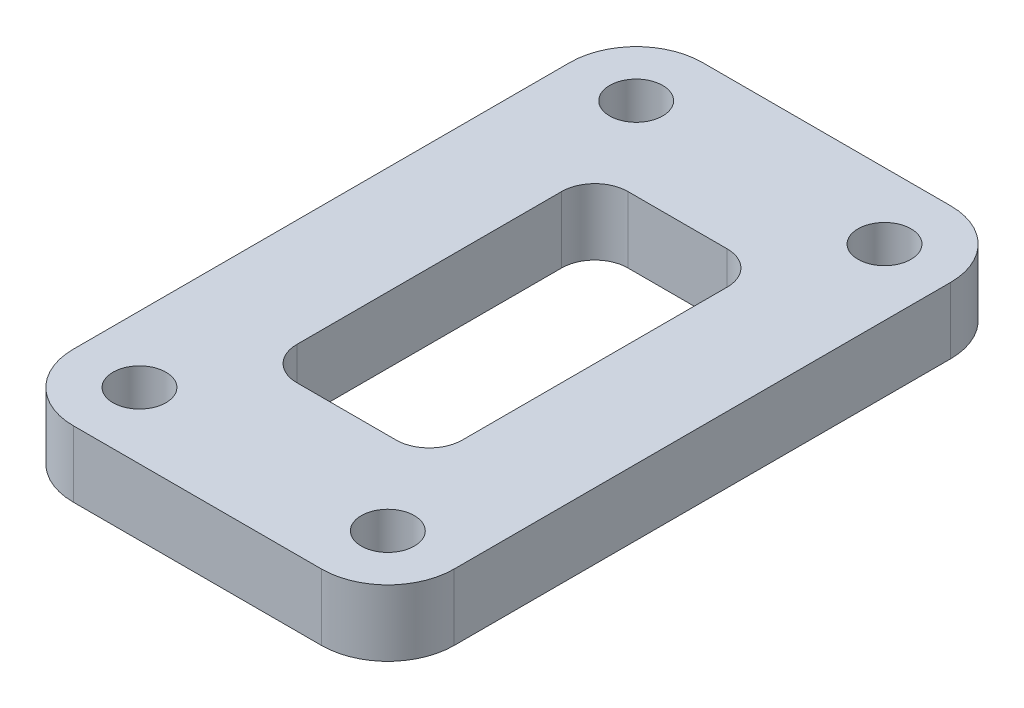
ISO-10303-21;
HEADER;
FILE_DESCRIPTION(('STEP AP214'),'2;1');
FILE_NAME('part.step','',(''),(''),'','','');
FILE_SCHEMA(('AUTOMOTIVE_DESIGN { 1 0 10303 214 1 1 1 1 }'));
ENDSEC;
DATA;
#1=APPLICATION_CONTEXT('core data for automotive mechanical design processes');
#2=APPLICATION_PROTOCOL_DEFINITION('international standard','automotive_design',2000,#1);
#3=PRODUCT_CONTEXT('',#1,'mechanical');
#4=PRODUCT('Part','Part','',(#3));
#5=PRODUCT_RELATED_PRODUCT_CATEGORY('part','',(#4));
#6=PRODUCT_DEFINITION_FORMATION('','',#4);
#7=PRODUCT_DEFINITION_CONTEXT('part definition',#1,'design');
#8=PRODUCT_DEFINITION('design','',#6,#7);
#9=PRODUCT_DEFINITION_SHAPE('','',#8);
#10=(LENGTH_UNIT() NAMED_UNIT(*) SI_UNIT(.MILLI.,.METRE.));
#11=(NAMED_UNIT(*) PLANE_ANGLE_UNIT() SI_UNIT($,.RADIAN.));
#12=(NAMED_UNIT(*) SI_UNIT($,.STERADIAN.) SOLID_ANGLE_UNIT());
#13=UNCERTAINTY_MEASURE_WITH_UNIT(LENGTH_MEASURE(1.E-05),#10,'distance_accuracy_value','');
#14=(GEOMETRIC_REPRESENTATION_CONTEXT(3) GLOBAL_UNCERTAINTY_ASSIGNED_CONTEXT((#13)) GLOBAL_UNIT_ASSIGNED_CONTEXT((#10,
#11,#12)) REPRESENTATION_CONTEXT('',''));
#15=CARTESIAN_POINT('',(0.,0.,0.));
#16=DIRECTION('',(0.,0.,1.));
#17=DIRECTION('',(1.,0.,0.));
#18=AXIS2_PLACEMENT_3D('',#15,#16,#17);
#19=CARTESIAN_POINT('',(-7.5,4.,15.));
#20=DIRECTION('',(0.,1.,0.));
#21=DIRECTION('',(0.,0.,1.));
#22=AXIS2_PLACEMENT_3D('',#19,#20,#21);
#23=PLANE('',#22);
#24=CARTESIAN_POINT('',(3.,4.,8.));
#25=DIRECTION('',(0.,1.,0.));
#26=DIRECTION('',(0.,0.,1.));
#27=AXIS2_PLACEMENT_3D('',#24,#25,#26);
#28=CIRCLE('',#27,2.);
#29=CARTESIAN_POINT('',(2.99999999999999,4.,10.));
#30=VERTEX_POINT('',#29);
#31=CARTESIAN_POINT('',(5.,4.,7.99999999999999));
#32=VERTEX_POINT('',#31);
#33=EDGE_CURVE('E61',#30,#32,#28,.T.);
#34=ORIENTED_EDGE('',*,*,#33,.F.);
#35=DIRECTION('',(1.,0.,0.));
#36=VECTOR('',#35,1.);
#37=CARTESIAN_POINT('',(-2.99999999999998,4.,10.));
#38=LINE('',#37,#36);
#39=CARTESIAN_POINT('',(-2.99999999999998,4.,10.));
#40=VERTEX_POINT('',#39);
#41=EDGE_CURVE('E181',#40,#30,#38,.T.);
#42=ORIENTED_EDGE('',*,*,#41,.F.);
#43=CARTESIAN_POINT('',(-3.,4.,8.));
#44=DIRECTION('',(0.,1.,0.));
#45=DIRECTION('',(0.,0.,1.));
#46=AXIS2_PLACEMENT_3D('',#43,#44,#45);
#47=CIRCLE('',#46,2.);
#48=CARTESIAN_POINT('',(-5.,4.,7.99999999999999));
#49=VERTEX_POINT('',#48);
#50=EDGE_CURVE('E185',#49,#40,#47,.T.);
#51=ORIENTED_EDGE('',*,*,#50,.F.);
#52=DIRECTION('',(0.,0.,1.));
#53=VECTOR('',#52,1.);
#54=CARTESIAN_POINT('',(-5.,4.,-7.99999999999999));
#55=LINE('',#54,#53);
#56=CARTESIAN_POINT('',(-5.,4.,-7.99999999999999));
#57=VERTEX_POINT('',#56);
#58=EDGE_CURVE('E224',#57,#49,#55,.T.);
#59=ORIENTED_EDGE('',*,*,#58,.F.);
#60=CARTESIAN_POINT('',(-3.,4.,-8.));
#61=DIRECTION('',(0.,1.,0.));
#62=DIRECTION('',(0.,0.,1.));
#63=AXIS2_PLACEMENT_3D('',#60,#61,#62);
#64=CIRCLE('',#63,2.);
#65=CARTESIAN_POINT('',(-2.99999999999999,4.,-10.));
#66=VERTEX_POINT('',#65);
#67=EDGE_CURVE('E220',#66,#57,#64,.T.);
#68=ORIENTED_EDGE('',*,*,#67,.F.);
#69=DIRECTION('',(-1.,0.,0.));
#70=VECTOR('',#69,1.);
#71=CARTESIAN_POINT('',(-2.99999999999999,4.,-10.));
#72=LINE('',#71,#70);
#73=CARTESIAN_POINT('',(2.99999999999999,4.,-10.));
#74=VERTEX_POINT('',#73);
#75=EDGE_CURVE('E216',#74,#66,#72,.T.);
#76=ORIENTED_EDGE('',*,*,#75,.F.);
#77=CARTESIAN_POINT('',(3.,4.,-8.));
#78=DIRECTION('',(0.,1.,0.));
#79=DIRECTION('',(0.,0.,-1.));
#80=AXIS2_PLACEMENT_3D('',#77,#78,#79);
#81=CIRCLE('',#80,2.);
#82=CARTESIAN_POINT('',(5.,4.,-7.99999999999999));
#83=VERTEX_POINT('',#82);
#84=EDGE_CURVE('E212',#83,#74,#81,.T.);
#85=ORIENTED_EDGE('',*,*,#84,.F.);
#86=DIRECTION('',(0.,0.,-1.));
#87=VECTOR('',#86,1.);
#88=CARTESIAN_POINT('',(5.,4.,-7.99999999999999));
#89=LINE('',#88,#87);
#90=EDGE_CURVE('E209',#32,#83,#89,.T.);
#91=ORIENTED_EDGE('',*,*,#90,.F.);
#92=EDGE_LOOP('',(#34,#42,#51,#59,#68,#76,#85,#91));
#93=FACE_BOUND('',#92,.T.);
#94=CARTESIAN_POINT('',(-7.5,4.,15.));
#95=DIRECTION('',(0.,1.,0.));
#96=DIRECTION('',(0.,0.,1.));
#97=AXIS2_PLACEMENT_3D('',#94,#95,#96);
#98=CIRCLE('',#97,1.6);
#99=CARTESIAN_POINT('',(-7.5,4.,16.6));
#100=VERTEX_POINT('',#99);
#101=EDGE_CURVE('E260',#100,#100,#98,.T.);
#102=ORIENTED_EDGE('',*,*,#101,.F.);
#103=EDGE_LOOP('',(#102));
#104=FACE_BOUND('',#103,.T.);
#105=CARTESIAN_POINT('',(-7.5,4.,-15.));
#106=DIRECTION('',(0.,1.,0.));
#107=DIRECTION('',(0.,0.,1.));
#108=AXIS2_PLACEMENT_3D('',#105,#106,#107);
#109=CIRCLE('',#108,1.6);
#110=CARTESIAN_POINT('',(-7.5,4.,-13.4));
#111=VERTEX_POINT('',#110);
#112=EDGE_CURVE('E276',#111,#111,#109,.T.);
#113=ORIENTED_EDGE('',*,*,#112,.F.);
#114=EDGE_LOOP('',(#113));
#115=FACE_BOUND('',#114,.T.);
#116=CARTESIAN_POINT('',(-7.5,4.,15.));
#117=DIRECTION('',(0.,1.,0.));
#118=DIRECTION('',(0.,0.,1.));
#119=AXIS2_PLACEMENT_3D('',#116,#117,#118);
#120=CIRCLE('',#119,4.);
#121=CARTESIAN_POINT('',(-11.5,4.,15.));
#122=VERTEX_POINT('',#121);
#123=CARTESIAN_POINT('',(-7.49999999999997,4.,19.));
#124=VERTEX_POINT('',#123);
#125=EDGE_CURVE('E284',#122,#124,#120,.T.);
#126=ORIENTED_EDGE('',*,*,#125,.T.);
#127=DIRECTION('',(1.,0.,0.));
#128=VECTOR('',#127,1.);
#129=CARTESIAN_POINT('',(-7.49999999999997,4.,19.));
#130=LINE('',#129,#128);
#131=CARTESIAN_POINT('',(7.49999999999997,4.,19.));
#132=VERTEX_POINT('',#131);
#133=EDGE_CURVE('E288',#124,#132,#130,.T.);
#134=ORIENTED_EDGE('',*,*,#133,.T.);
#135=CARTESIAN_POINT('',(7.5,4.,15.));
#136=DIRECTION('',(0.,1.,0.));
#137=DIRECTION('',(0.,0.,1.));
#138=AXIS2_PLACEMENT_3D('',#135,#136,#137);
#139=CIRCLE('',#138,4.);
#140=CARTESIAN_POINT('',(11.5,4.,15.));
#141=VERTEX_POINT('',#140);
#142=EDGE_CURVE('E292',#132,#141,#139,.T.);
#143=ORIENTED_EDGE('',*,*,#142,.T.);
#144=DIRECTION('',(0.,0.,-1.));
#145=VECTOR('',#144,1.);
#146=CARTESIAN_POINT('',(11.5,4.,-15.));
#147=LINE('',#146,#145);
#148=CARTESIAN_POINT('',(11.5,4.,-15.));
#149=VERTEX_POINT('',#148);
#150=EDGE_CURVE('E295',#141,#149,#147,.T.);
#151=ORIENTED_EDGE('',*,*,#150,.T.);
#152=CARTESIAN_POINT('',(7.5,4.,-15.));
#153=DIRECTION('',(0.,1.,0.));
#154=DIRECTION('',(0.,0.,1.));
#155=AXIS2_PLACEMENT_3D('',#152,#153,#154);
#156=CIRCLE('',#155,4.);
#157=CARTESIAN_POINT('',(7.49999999999997,4.,-19.));
#158=VERTEX_POINT('',#157);
#159=EDGE_CURVE('E298',#149,#158,#156,.T.);
#160=ORIENTED_EDGE('',*,*,#159,.T.);
#161=DIRECTION('',(-1.,0.,0.));
#162=VECTOR('',#161,1.);
#163=CARTESIAN_POINT('',(-7.49999999999997,4.,-19.));
#164=LINE('',#163,#162);
#165=CARTESIAN_POINT('',(-7.5,4.,-19.));
#166=VERTEX_POINT('',#165);
#167=EDGE_CURVE('E301',#158,#166,#164,.T.);
#168=ORIENTED_EDGE('',*,*,#167,.T.);
#169=CARTESIAN_POINT('',(-7.5,4.,-15.));
#170=DIRECTION('',(0.,1.,0.));
#171=DIRECTION('',(0.,0.,-1.));
#172=AXIS2_PLACEMENT_3D('',#169,#170,#171);
#173=CIRCLE('',#172,4.);
#174=CARTESIAN_POINT('',(-11.5,4.,-15.));
#175=VERTEX_POINT('',#174);
#176=EDGE_CURVE('E304',#166,#175,#173,.T.);
#177=ORIENTED_EDGE('',*,*,#176,.T.);
#178=DIRECTION('',(0.,0.,1.));
#179=VECTOR('',#178,1.);
#180=CARTESIAN_POINT('',(-11.5,4.,-15.));
#181=LINE('',#180,#179);
#182=EDGE_CURVE('E307',#175,#122,#181,.T.);
#183=ORIENTED_EDGE('',*,*,#182,.T.);
#184=EDGE_LOOP('',(#126,#134,#143,#151,#160,#168,#177,#183));
#185=FACE_BOUND('',#184,.T.);
#186=CARTESIAN_POINT('',(7.5,4.,-15.));
#187=DIRECTION('',(0.,1.,0.));
#188=DIRECTION('',(0.,0.,1.));
#189=AXIS2_PLACEMENT_3D('',#186,#187,#188);
#190=CIRCLE('',#189,1.6);
#191=CARTESIAN_POINT('',(7.5,4.,-13.4));
#192=VERTEX_POINT('',#191);
#193=EDGE_CURVE('E268',#192,#192,#190,.T.);
#194=ORIENTED_EDGE('',*,*,#193,.F.);
#195=EDGE_LOOP('',(#194));
#196=FACE_BOUND('',#195,.T.);
#197=CARTESIAN_POINT('',(7.5,4.,15.));
#198=DIRECTION('',(0.,1.,0.));
#199=DIRECTION('',(0.,0.,1.));
#200=AXIS2_PLACEMENT_3D('',#197,#198,#199);
#201=CIRCLE('',#200,1.6);
#202=CARTESIAN_POINT('',(7.5,4.,16.6));
#203=VERTEX_POINT('',#202);
#204=EDGE_CURVE('E252',#203,#203,#201,.T.);
#205=ORIENTED_EDGE('',*,*,#204,.F.);
#206=EDGE_LOOP('',(#205));
#207=FACE_BOUND('',#206,.T.);
#208=ADVANCED_FACE('F45',(#93,#104,#115,#185,#196,#207),#23,.T.);
#209=CARTESIAN_POINT('',(-7.5,0.,15.));
#210=DIRECTION('',(0.,1.,0.));
#211=DIRECTION('',(0.,0.,1.));
#212=AXIS2_PLACEMENT_3D('',#209,#210,#211);
#213=PLANE('',#212);
#214=DIRECTION('',(1.,0.,0.));
#215=VECTOR('',#214,1.);
#216=CARTESIAN_POINT('',(-2.99999999999998,0.,10.));
#217=LINE('',#216,#215);
#218=CARTESIAN_POINT('',(-2.99999999999998,0.,10.));
#219=VERTEX_POINT('',#218);
#220=CARTESIAN_POINT('',(2.99999999999999,0.,10.));
#221=VERTEX_POINT('',#220);
#222=EDGE_CURVE('E168',#219,#221,#217,.T.);
#223=ORIENTED_EDGE('',*,*,#222,.T.);
#224=CARTESIAN_POINT('',(3.,0.,8.));
#225=DIRECTION('',(0.,1.,0.));
#226=DIRECTION('',(0.,0.,1.));
#227=AXIS2_PLACEMENT_3D('',#224,#225,#226);
#228=CIRCLE('',#227,2.);
#229=CARTESIAN_POINT('',(5.,0.,7.99999999999999));
#230=VERTEX_POINT('',#229);
#231=EDGE_CURVE('E161',#221,#230,#228,.T.);
#232=ORIENTED_EDGE('',*,*,#231,.T.);
#233=DIRECTION('',(0.,0.,-1.));
#234=VECTOR('',#233,1.);
#235=CARTESIAN_POINT('',(5.,0.,-7.99999999999999));
#236=LINE('',#235,#234);
#237=CARTESIAN_POINT('',(5.,0.,-7.99999999999999));
#238=VERTEX_POINT('',#237);
#239=EDGE_CURVE('E171',#230,#238,#236,.T.);
#240=ORIENTED_EDGE('',*,*,#239,.T.);
#241=CARTESIAN_POINT('',(3.,0.,-8.));
#242=DIRECTION('',(0.,1.,0.));
#243=DIRECTION('',(0.,0.,-1.));
#244=AXIS2_PLACEMENT_3D('',#241,#242,#243);
#245=CIRCLE('',#244,2.);
#246=CARTESIAN_POINT('',(2.99999999999999,0.,-10.));
#247=VERTEX_POINT('',#246);
#248=EDGE_CURVE('E69',#238,#247,#245,.T.);
#249=ORIENTED_EDGE('',*,*,#248,.T.);
#250=DIRECTION('',(-1.,0.,0.));
#251=VECTOR('',#250,1.);
#252=CARTESIAN_POINT('',(-2.99999999999999,0.,-10.));
#253=LINE('',#252,#251);
#254=CARTESIAN_POINT('',(-2.99999999999999,0.,-10.));
#255=VERTEX_POINT('',#254);
#256=EDGE_CURVE('E190',#247,#255,#253,.T.);
#257=ORIENTED_EDGE('',*,*,#256,.T.);
#258=CARTESIAN_POINT('',(-3.,0.,-8.));
#259=DIRECTION('',(0.,1.,0.));
#260=DIRECTION('',(0.,0.,1.));
#261=AXIS2_PLACEMENT_3D('',#258,#259,#260);
#262=CIRCLE('',#261,2.);
#263=CARTESIAN_POINT('',(-5.,0.,-7.99999999999999));
#264=VERTEX_POINT('',#263);
#265=EDGE_CURVE('E194',#255,#264,#262,.T.);
#266=ORIENTED_EDGE('',*,*,#265,.T.);
#267=DIRECTION('',(0.,0.,1.));
#268=VECTOR('',#267,1.);
#269=CARTESIAN_POINT('',(-5.,0.,-7.99999999999999));
#270=LINE('',#269,#268);
#271=CARTESIAN_POINT('',(-5.,0.,7.99999999999999));
#272=VERTEX_POINT('',#271);
#273=EDGE_CURVE('E198',#264,#272,#270,.T.);
#274=ORIENTED_EDGE('',*,*,#273,.T.);
#275=CARTESIAN_POINT('',(-3.,0.,8.));
#276=DIRECTION('',(0.,1.,0.));
#277=DIRECTION('',(0.,0.,1.));
#278=AXIS2_PLACEMENT_3D('',#275,#276,#277);
#279=CIRCLE('',#278,2.);
#280=EDGE_CURVE('E202',#272,#219,#279,.T.);
#281=ORIENTED_EDGE('',*,*,#280,.T.);
#282=EDGE_LOOP('',(#223,#232,#240,#249,#257,#266,#274,#281));
#283=FACE_BOUND('',#282,.T.);
#284=CARTESIAN_POINT('',(-7.5,0.,15.));
#285=DIRECTION('',(0.,1.,0.));
#286=DIRECTION('',(0.,0.,1.));
#287=AXIS2_PLACEMENT_3D('',#284,#285,#286);
#288=CIRCLE('',#287,4.);
#289=CARTESIAN_POINT('',(-11.5,0.,15.));
#290=VERTEX_POINT('',#289);
#291=CARTESIAN_POINT('',(-7.49999999999997,0.,19.));
#292=VERTEX_POINT('',#291);
#293=EDGE_CURVE('E280',#290,#292,#288,.T.);
#294=ORIENTED_EDGE('',*,*,#293,.F.);
#295=DIRECTION('',(0.,0.,1.));
#296=VECTOR('',#295,1.);
#297=CARTESIAN_POINT('',(-11.5,0.,-15.));
#298=LINE('',#297,#296);
#299=CARTESIAN_POINT('',(-11.5,0.,-15.));
#300=VERTEX_POINT('',#299);
#301=EDGE_CURVE('E289',#300,#290,#298,.T.);
#302=ORIENTED_EDGE('',*,*,#301,.F.);
#303=CARTESIAN_POINT('',(-7.5,0.,-15.));
#304=DIRECTION('',(0.,1.,0.));
#305=DIRECTION('',(0.,0.,-1.));
#306=AXIS2_PLACEMENT_3D('',#303,#304,#305);
#307=CIRCLE('',#306,4.);
#308=CARTESIAN_POINT('',(-7.5,0.,-19.));
#309=VERTEX_POINT('',#308);
#310=EDGE_CURVE('E329',#309,#300,#307,.T.);
#311=ORIENTED_EDGE('',*,*,#310,.F.);
#312=DIRECTION('',(-1.,0.,0.));
#313=VECTOR('',#312,1.);
#314=CARTESIAN_POINT('',(-7.49999999999997,0.,-19.));
#315=LINE('',#314,#313);
#316=CARTESIAN_POINT('',(7.49999999999997,0.,-19.));
#317=VERTEX_POINT('',#316);
#318=EDGE_CURVE('E326',#317,#309,#315,.T.);
#319=ORIENTED_EDGE('',*,*,#318,.F.);
#320=CARTESIAN_POINT('',(7.5,0.,-15.));
#321=DIRECTION('',(0.,1.,0.));
#322=DIRECTION('',(0.,0.,1.));
#323=AXIS2_PLACEMENT_3D('',#320,#321,#322);
#324=CIRCLE('',#323,4.);
#325=CARTESIAN_POINT('',(11.5,0.,-15.));
#326=VERTEX_POINT('',#325);
#327=EDGE_CURVE('E323',#326,#317,#324,.T.);
#328=ORIENTED_EDGE('',*,*,#327,.F.);
#329=DIRECTION('',(0.,0.,-1.));
#330=VECTOR('',#329,1.);
#331=CARTESIAN_POINT('',(11.5,0.,-15.));
#332=LINE('',#331,#330);
#333=CARTESIAN_POINT('',(11.5,0.,15.));
#334=VERTEX_POINT('',#333);
#335=EDGE_CURVE('E320',#334,#326,#332,.T.);
#336=ORIENTED_EDGE('',*,*,#335,.F.);
#337=CARTESIAN_POINT('',(7.5,0.,15.));
#338=DIRECTION('',(0.,1.,0.));
#339=DIRECTION('',(0.,0.,1.));
#340=AXIS2_PLACEMENT_3D('',#337,#338,#339);
#341=CIRCLE('',#340,4.);
#342=CARTESIAN_POINT('',(7.49999999999997,0.,19.));
#343=VERTEX_POINT('',#342);
#344=EDGE_CURVE('E317',#343,#334,#341,.T.);
#345=ORIENTED_EDGE('',*,*,#344,.F.);
#346=DIRECTION('',(1.,0.,0.));
#347=VECTOR('',#346,1.);
#348=CARTESIAN_POINT('',(-7.49999999999997,0.,19.));
#349=LINE('',#348,#347);
#350=EDGE_CURVE('E314',#292,#343,#349,.T.);
#351=ORIENTED_EDGE('',*,*,#350,.F.);
#352=EDGE_LOOP('',(#294,#302,#311,#319,#328,#336,#345,#351));
#353=FACE_BOUND('',#352,.T.);
#354=CARTESIAN_POINT('',(-7.5,0.,-15.));
#355=DIRECTION('',(0.,1.,0.));
#356=DIRECTION('',(0.,0.,1.));
#357=AXIS2_PLACEMENT_3D('',#354,#355,#356);
#358=CIRCLE('',#357,1.6);
#359=CARTESIAN_POINT('',(-7.5,0.,-13.4));
#360=VERTEX_POINT('',#359);
#361=EDGE_CURVE('E272',#360,#360,#358,.T.);
#362=ORIENTED_EDGE('',*,*,#361,.T.);
#363=EDGE_LOOP('',(#362));
#364=FACE_BOUND('',#363,.T.);
#365=CARTESIAN_POINT('',(7.5,0.,-15.));
#366=DIRECTION('',(0.,1.,0.));
#367=DIRECTION('',(0.,0.,1.));
#368=AXIS2_PLACEMENT_3D('',#365,#366,#367);
#369=CIRCLE('',#368,1.6);
#370=CARTESIAN_POINT('',(7.5,0.,-13.4));
#371=VERTEX_POINT('',#370);
#372=EDGE_CURVE('E264',#371,#371,#369,.T.);
#373=ORIENTED_EDGE('',*,*,#372,.T.);
#374=EDGE_LOOP('',(#373));
#375=FACE_BOUND('',#374,.T.);
#376=CARTESIAN_POINT('',(-7.5,0.,15.));
#377=DIRECTION('',(0.,1.,0.));
#378=DIRECTION('',(0.,0.,1.));
#379=AXIS2_PLACEMENT_3D('',#376,#377,#378);
#380=CIRCLE('',#379,1.6);
#381=CARTESIAN_POINT('',(-7.5,0.,16.6));
#382=VERTEX_POINT('',#381);
#383=EDGE_CURVE('E256',#382,#382,#380,.T.);
#384=ORIENTED_EDGE('',*,*,#383,.T.);
#385=EDGE_LOOP('',(#384));
#386=FACE_BOUND('',#385,.T.);
#387=CARTESIAN_POINT('',(7.5,0.,15.));
#388=DIRECTION('',(0.,1.,0.));
#389=DIRECTION('',(0.,0.,1.));
#390=AXIS2_PLACEMENT_3D('',#387,#388,#389);
#391=CIRCLE('',#390,1.6);
#392=CARTESIAN_POINT('',(7.5,0.,16.6));
#393=VERTEX_POINT('',#392);
#394=EDGE_CURVE('E234',#393,#393,#391,.T.);
#395=ORIENTED_EDGE('',*,*,#394,.T.);
#396=EDGE_LOOP('',(#395));
#397=FACE_BOUND('',#396,.T.);
#398=ADVANCED_FACE('F176',(#283,#353,#364,#375,#386,#397),#213,.F.);
#399=CARTESIAN_POINT('',(-7.5,4.,15.));
#400=DIRECTION('',(0.,-1.,0.));
#401=DIRECTION('',(0.,0.,-1.));
#402=AXIS2_PLACEMENT_3D('',#399,#400,#401);
#403=CYLINDRICAL_SURFACE('',#402,4.);
#404=ORIENTED_EDGE('',*,*,#293,.T.);
#405=DIRECTION('',(0.,-1.,0.));
#406=VECTOR('',#405,1.);
#407=CARTESIAN_POINT('',(-7.49999999999997,4.,19.));
#408=LINE('',#407,#406);
#409=EDGE_CURVE('E11',#124,#292,#408,.T.);
#410=ORIENTED_EDGE('',*,*,#409,.F.);
#411=ORIENTED_EDGE('',*,*,#125,.F.);
#412=DIRECTION('',(0.,-1.,0.));
#413=VECTOR('',#412,1.);
#414=CARTESIAN_POINT('',(-11.5,4.,15.));
#415=LINE('',#414,#413);
#416=EDGE_CURVE('E310',#122,#290,#415,.T.);
#417=ORIENTED_EDGE('',*,*,#416,.T.);
#418=EDGE_LOOP('',(#404,#410,#411,#417));
#419=FACE_BOUND('',#418,.T.);
#420=ADVANCED_FACE('F47',(#419),#403,.T.);
#421=CARTESIAN_POINT('',(-7.49999999999997,4.,19.));
#422=DIRECTION('',(0.,0.,-1.));
#423=DIRECTION('',(-1.,0.,0.));
#424=AXIS2_PLACEMENT_3D('',#421,#422,#423);
#425=PLANE('',#424);
#426=ORIENTED_EDGE('',*,*,#350,.T.);
#427=DIRECTION('',(0.,-1.,0.));
#428=VECTOR('',#427,1.);
#429=CARTESIAN_POINT('',(7.49999999999997,4.,19.));
#430=LINE('',#429,#428);
#431=EDGE_CURVE('E54',#132,#343,#430,.T.);
#432=ORIENTED_EDGE('',*,*,#431,.F.);
#433=ORIENTED_EDGE('',*,*,#133,.F.);
#434=ORIENTED_EDGE('',*,*,#409,.T.);
#435=EDGE_LOOP('',(#426,#432,#433,#434));
#436=FACE_BOUND('',#435,.T.);
#437=ADVANCED_FACE('F384',(#436),#425,.F.);
#438=CARTESIAN_POINT('',(7.5,4.,15.));
#439=DIRECTION('',(0.,-1.,0.));
#440=DIRECTION('',(0.,0.,-1.));
#441=AXIS2_PLACEMENT_3D('',#438,#439,#440);
#442=CYLINDRICAL_SURFACE('',#441,4.);
#443=ORIENTED_EDGE('',*,*,#344,.T.);
#444=DIRECTION('',(0.,-1.,0.));
#445=VECTOR('',#444,1.);
#446=CARTESIAN_POINT('',(11.5,4.,15.));
#447=LINE('',#446,#445);
#448=EDGE_CURVE('E353',#141,#334,#447,.T.);
#449=ORIENTED_EDGE('',*,*,#448,.F.);
#450=ORIENTED_EDGE('',*,*,#142,.F.);
#451=ORIENTED_EDGE('',*,*,#431,.T.);
#452=EDGE_LOOP('',(#443,#449,#450,#451));
#453=FACE_BOUND('',#452,.T.);
#454=ADVANCED_FACE('F362',(#453),#442,.T.);
#455=CARTESIAN_POINT('',(11.5,4.,-15.));
#456=DIRECTION('',(-1.,0.,0.));
#457=DIRECTION('',(0.,0.,1.));
#458=AXIS2_PLACEMENT_3D('',#455,#456,#457);
#459=PLANE('',#458);
#460=ORIENTED_EDGE('',*,*,#335,.T.);
#461=DIRECTION('',(0.,-1.,0.));
#462=VECTOR('',#461,1.);
#463=CARTESIAN_POINT('',(11.5,4.,-15.));
#464=LINE('',#463,#462);
#465=EDGE_CURVE('E349',#149,#326,#464,.T.);
#466=ORIENTED_EDGE('',*,*,#465,.F.);
#467=ORIENTED_EDGE('',*,*,#150,.F.);
#468=ORIENTED_EDGE('',*,*,#448,.T.);
#469=EDGE_LOOP('',(#460,#466,#467,#468));
#470=FACE_BOUND('',#469,.T.);
#471=ADVANCED_FACE('F372',(#470),#459,.F.);
#472=CARTESIAN_POINT('',(7.5,4.,-15.));
#473=DIRECTION('',(0.,-1.,0.));
#474=DIRECTION('',(0.,0.,-1.));
#475=AXIS2_PLACEMENT_3D('',#472,#473,#474);
#476=CYLINDRICAL_SURFACE('',#475,4.);
#477=ORIENTED_EDGE('',*,*,#327,.T.);
#478=DIRECTION('',(0.,-1.,0.));
#479=VECTOR('',#478,1.);
#480=CARTESIAN_POINT('',(7.49999999999997,4.,-19.));
#481=LINE('',#480,#479);
#482=EDGE_CURVE('E345',#158,#317,#481,.T.);
#483=ORIENTED_EDGE('',*,*,#482,.F.);
#484=ORIENTED_EDGE('',*,*,#159,.F.);
#485=ORIENTED_EDGE('',*,*,#465,.T.);
#486=EDGE_LOOP('',(#477,#483,#484,#485));
#487=FACE_BOUND('',#486,.T.);
#488=ADVANCED_FACE('F376',(#487),#476,.T.);
#489=CARTESIAN_POINT('',(-7.49999999999997,4.,-19.));
#490=DIRECTION('',(0.,0.,1.));
#491=DIRECTION('',(1.,0.,0.));
#492=AXIS2_PLACEMENT_3D('',#489,#490,#491);
#493=PLANE('',#492);
#494=ORIENTED_EDGE('',*,*,#318,.T.);
#495=DIRECTION('',(0.,-1.,0.));
#496=VECTOR('',#495,1.);
#497=CARTESIAN_POINT('',(-7.5,4.,-19.));
#498=LINE('',#497,#496);
#499=EDGE_CURVE('E341',#166,#309,#498,.T.);
#500=ORIENTED_EDGE('',*,*,#499,.F.);
#501=ORIENTED_EDGE('',*,*,#167,.F.);
#502=ORIENTED_EDGE('',*,*,#482,.T.);
#503=EDGE_LOOP('',(#494,#500,#501,#502));
#504=FACE_BOUND('',#503,.T.);
#505=ADVANCED_FACE('F397',(#504),#493,.F.);
#506=CARTESIAN_POINT('',(-7.5,4.,-15.));
#507=DIRECTION('',(0.,-1.,0.));
#508=DIRECTION('',(0.,0.,-1.));
#509=AXIS2_PLACEMENT_3D('',#506,#507,#508);
#510=CYLINDRICAL_SURFACE('',#509,4.);
#511=ORIENTED_EDGE('',*,*,#310,.T.);
#512=DIRECTION('',(0.,-1.,0.));
#513=VECTOR('',#512,1.);
#514=CARTESIAN_POINT('',(-11.5,4.,-15.));
#515=LINE('',#514,#513);
#516=EDGE_CURVE('E337',#175,#300,#515,.T.);
#517=ORIENTED_EDGE('',*,*,#516,.F.);
#518=ORIENTED_EDGE('',*,*,#176,.F.);
#519=ORIENTED_EDGE('',*,*,#499,.T.);
#520=EDGE_LOOP('',(#511,#517,#518,#519));
#521=FACE_BOUND('',#520,.T.);
#522=ADVANCED_FACE('F395',(#521),#510,.T.);
#523=CARTESIAN_POINT('',(-11.5,4.,-15.));
#524=DIRECTION('',(1.,0.,0.));
#525=DIRECTION('',(0.,0.,-1.));
#526=AXIS2_PLACEMENT_3D('',#523,#524,#525);
#527=PLANE('',#526);
#528=ORIENTED_EDGE('',*,*,#301,.T.);
#529=ORIENTED_EDGE('',*,*,#416,.F.);
#530=ORIENTED_EDGE('',*,*,#182,.F.);
#531=ORIENTED_EDGE('',*,*,#516,.T.);
#532=EDGE_LOOP('',(#528,#529,#530,#531));
#533=FACE_BOUND('',#532,.T.);
#534=ADVANCED_FACE('F390',(#533),#527,.F.);
#535=CARTESIAN_POINT('',(-7.5,4.,-15.));
#536=DIRECTION('',(0.,-1.,0.));
#537=DIRECTION('',(0.,0.,-1.));
#538=AXIS2_PLACEMENT_3D('',#535,#536,#537);
#539=CYLINDRICAL_SURFACE('',#538,1.6);
#540=ORIENTED_EDGE('',*,*,#112,.T.);
#541=EDGE_LOOP('',(#540));
#542=FACE_BOUND('',#541,.T.);
#543=ORIENTED_EDGE('',*,*,#361,.F.);
#544=EDGE_LOOP('',(#543));
#545=FACE_BOUND('',#544,.T.);
#546=ADVANCED_FACE('F416',(#542,#545),#539,.F.);
#547=CARTESIAN_POINT('',(7.5,4.,-15.));
#548=DIRECTION('',(0.,-1.,0.));
#549=DIRECTION('',(0.,0.,-1.));
#550=AXIS2_PLACEMENT_3D('',#547,#548,#549);
#551=CYLINDRICAL_SURFACE('',#550,1.6);
#552=ORIENTED_EDGE('',*,*,#193,.T.);
#553=EDGE_LOOP('',(#552));
#554=FACE_BOUND('',#553,.T.);
#555=ORIENTED_EDGE('',*,*,#372,.F.);
#556=EDGE_LOOP('',(#555));
#557=FACE_BOUND('',#556,.T.);
#558=ADVANCED_FACE('F423',(#554,#557),#551,.F.);
#559=CARTESIAN_POINT('',(-7.5,4.,15.));
#560=DIRECTION('',(0.,-1.,0.));
#561=DIRECTION('',(0.,0.,-1.));
#562=AXIS2_PLACEMENT_3D('',#559,#560,#561);
#563=CYLINDRICAL_SURFACE('',#562,1.6);
#564=ORIENTED_EDGE('',*,*,#101,.T.);
#565=EDGE_LOOP('',(#564));
#566=FACE_BOUND('',#565,.T.);
#567=ORIENTED_EDGE('',*,*,#383,.F.);
#568=EDGE_LOOP('',(#567));
#569=FACE_BOUND('',#568,.T.);
#570=ADVANCED_FACE('F428',(#566,#569),#563,.F.);
#571=CARTESIAN_POINT('',(7.5,4.,15.));
#572=DIRECTION('',(0.,-1.,0.));
#573=DIRECTION('',(0.,0.,-1.));
#574=AXIS2_PLACEMENT_3D('',#571,#572,#573);
#575=CYLINDRICAL_SURFACE('',#574,1.6);
#576=ORIENTED_EDGE('',*,*,#204,.T.);
#577=EDGE_LOOP('',(#576));
#578=FACE_BOUND('',#577,.T.);
#579=ORIENTED_EDGE('',*,*,#394,.F.);
#580=EDGE_LOOP('',(#579));
#581=FACE_BOUND('',#580,.T.);
#582=ADVANCED_FACE('F440',(#578,#581),#575,.F.);
#583=CARTESIAN_POINT('',(3.,0.,8.));
#584=DIRECTION('',(0.,1.,0.));
#585=DIRECTION('',(0.,0.,1.));
#586=AXIS2_PLACEMENT_3D('',#583,#584,#585);
#587=CYLINDRICAL_SURFACE('',#586,2.);
#588=ORIENTED_EDGE('',*,*,#33,.T.);
#589=DIRECTION('',(0.,1.,0.));
#590=VECTOR('',#589,1.);
#591=CARTESIAN_POINT('',(5.,0.,7.99999999999999));
#592=LINE('',#591,#590);
#593=EDGE_CURVE('E157',#230,#32,#592,.T.);
#594=ORIENTED_EDGE('',*,*,#593,.F.);
#595=ORIENTED_EDGE('',*,*,#231,.F.);
#596=DIRECTION('',(0.,1.,0.));
#597=VECTOR('',#596,1.);
#598=CARTESIAN_POINT('',(2.99999999999999,0.,10.));
#599=LINE('',#598,#597);
#600=EDGE_CURVE('E231',#221,#30,#599,.T.);
#601=ORIENTED_EDGE('',*,*,#600,.T.);
#602=EDGE_LOOP('',(#588,#594,#595,#601));
#603=FACE_BOUND('',#602,.T.);
#604=ADVANCED_FACE('F159',(#603),#587,.F.);
#605=CARTESIAN_POINT('',(-2.99999999999998,0.,10.));
#606=DIRECTION('',(0.,0.,1.));
#607=DIRECTION('',(1.,0.,0.));
#608=AXIS2_PLACEMENT_3D('',#605,#606,#607);
#609=PLANE('',#608);
#610=ORIENTED_EDGE('',*,*,#41,.T.);
#611=ORIENTED_EDGE('',*,*,#600,.F.);
#612=ORIENTED_EDGE('',*,*,#222,.F.);
#613=DIRECTION('',(0.,1.,0.));
#614=VECTOR('',#613,1.);
#615=CARTESIAN_POINT('',(-2.99999999999998,0.,10.));
#616=LINE('',#615,#614);
#617=EDGE_CURVE('E235',#219,#40,#616,.T.);
#618=ORIENTED_EDGE('',*,*,#617,.T.);
#619=EDGE_LOOP('',(#610,#611,#612,#618));
#620=FACE_BOUND('',#619,.T.);
#621=ADVANCED_FACE('F447',(#620),#609,.F.);
#622=CARTESIAN_POINT('',(-3.,0.,8.));
#623=DIRECTION('',(0.,1.,0.));
#624=DIRECTION('',(0.,0.,1.));
#625=AXIS2_PLACEMENT_3D('',#622,#623,#624);
#626=CYLINDRICAL_SURFACE('',#625,2.);
#627=ORIENTED_EDGE('',*,*,#50,.T.);
#628=ORIENTED_EDGE('',*,*,#617,.F.);
#629=ORIENTED_EDGE('',*,*,#280,.F.);
#630=DIRECTION('',(0.,1.,0.));
#631=VECTOR('',#630,1.);
#632=CARTESIAN_POINT('',(-5.,0.,7.99999999999999));
#633=LINE('',#632,#631);
#634=EDGE_CURVE('E238',#272,#49,#633,.T.);
#635=ORIENTED_EDGE('',*,*,#634,.T.);
#636=EDGE_LOOP('',(#627,#628,#629,#635));
#637=FACE_BOUND('',#636,.T.);
#638=ADVANCED_FACE('F468',(#637),#626,.F.);
#639=CARTESIAN_POINT('',(-5.,0.,-7.99999999999999));
#640=DIRECTION('',(-1.,0.,0.));
#641=DIRECTION('',(0.,0.,1.));
#642=AXIS2_PLACEMENT_3D('',#639,#640,#641);
#643=PLANE('',#642);
#644=ORIENTED_EDGE('',*,*,#58,.T.);
#645=ORIENTED_EDGE('',*,*,#634,.F.);
#646=ORIENTED_EDGE('',*,*,#273,.F.);
#647=DIRECTION('',(0.,1.,0.));
#648=VECTOR('',#647,1.);
#649=CARTESIAN_POINT('',(-5.,0.,-7.99999999999999));
#650=LINE('',#649,#648);
#651=EDGE_CURVE('E241',#264,#57,#650,.T.);
#652=ORIENTED_EDGE('',*,*,#651,.T.);
#653=EDGE_LOOP('',(#644,#645,#646,#652));
#654=FACE_BOUND('',#653,.T.);
#655=ADVANCED_FACE('F464',(#654),#643,.F.);
#656=CARTESIAN_POINT('',(-3.,0.,-8.));
#657=DIRECTION('',(0.,1.,0.));
#658=DIRECTION('',(0.,0.,1.));
#659=AXIS2_PLACEMENT_3D('',#656,#657,#658);
#660=CYLINDRICAL_SURFACE('',#659,2.);
#661=ORIENTED_EDGE('',*,*,#67,.T.);
#662=ORIENTED_EDGE('',*,*,#651,.F.);
#663=ORIENTED_EDGE('',*,*,#265,.F.);
#664=DIRECTION('',(0.,1.,0.));
#665=VECTOR('',#664,1.);
#666=CARTESIAN_POINT('',(-2.99999999999999,0.,-10.));
#667=LINE('',#666,#665);
#668=EDGE_CURVE('E244',#255,#66,#667,.T.);
#669=ORIENTED_EDGE('',*,*,#668,.T.);
#670=EDGE_LOOP('',(#661,#662,#663,#669));
#671=FACE_BOUND('',#670,.T.);
#672=ADVANCED_FACE('F460',(#671),#660,.F.);
#673=CARTESIAN_POINT('',(-2.99999999999999,0.,-10.));
#674=DIRECTION('',(0.,0.,-1.));
#675=DIRECTION('',(-1.,0.,0.));
#676=AXIS2_PLACEMENT_3D('',#673,#674,#675);
#677=PLANE('',#676);
#678=ORIENTED_EDGE('',*,*,#75,.T.);
#679=ORIENTED_EDGE('',*,*,#668,.F.);
#680=ORIENTED_EDGE('',*,*,#256,.F.);
#681=DIRECTION('',(0.,1.,0.));
#682=VECTOR('',#681,1.);
#683=CARTESIAN_POINT('',(2.99999999999999,0.,-10.));
#684=LINE('',#683,#682);
#685=EDGE_CURVE('E247',#247,#74,#684,.T.);
#686=ORIENTED_EDGE('',*,*,#685,.T.);
#687=EDGE_LOOP('',(#678,#679,#680,#686));
#688=FACE_BOUND('',#687,.T.);
#689=ADVANCED_FACE('F457',(#688),#677,.F.);
#690=CARTESIAN_POINT('',(3.,0.,-8.));
#691=DIRECTION('',(0.,1.,0.));
#692=DIRECTION('',(0.,0.,1.));
#693=AXIS2_PLACEMENT_3D('',#690,#691,#692);
#694=CYLINDRICAL_SURFACE('',#693,2.);
#695=ORIENTED_EDGE('',*,*,#84,.T.);
#696=ORIENTED_EDGE('',*,*,#685,.F.);
#697=ORIENTED_EDGE('',*,*,#248,.F.);
#698=DIRECTION('',(0.,1.,0.));
#699=VECTOR('',#698,1.);
#700=CARTESIAN_POINT('',(5.,0.,-7.99999999999999));
#701=LINE('',#700,#699);
#702=EDGE_CURVE('E167',#238,#83,#701,.T.);
#703=ORIENTED_EDGE('',*,*,#702,.T.);
#704=EDGE_LOOP('',(#695,#696,#697,#703));
#705=FACE_BOUND('',#704,.T.);
#706=ADVANCED_FACE('F454',(#705),#694,.F.);
#707=CARTESIAN_POINT('',(5.,0.,-7.99999999999999));
#708=DIRECTION('',(1.,0.,0.));
#709=DIRECTION('',(0.,0.,-1.));
#710=AXIS2_PLACEMENT_3D('',#707,#708,#709);
#711=PLANE('',#710);
#712=ORIENTED_EDGE('',*,*,#90,.T.);
#713=ORIENTED_EDGE('',*,*,#702,.F.);
#714=ORIENTED_EDGE('',*,*,#239,.F.);
#715=ORIENTED_EDGE('',*,*,#593,.T.);
#716=EDGE_LOOP('',(#712,#713,#714,#715));
#717=FACE_BOUND('',#716,.T.);
#718=ADVANCED_FACE('F172',(#717),#711,.F.);
#719=CLOSED_SHELL('',(#208,#398,#420,#437,#454,#471,#488,#505,#522,#534,#546,#558,#570,#582,
#604,#621,#638,#655,#672,#689,#706,#718));
#720=MANIFOLD_SOLID_BREP('B2',#719);
#721=ADVANCED_BREP_SHAPE_REPRESENTATION('',(#18,#720),#14);
#722=SHAPE_DEFINITION_REPRESENTATION(#9,#721);
ENDSEC;
END-ISO-10303-21;
